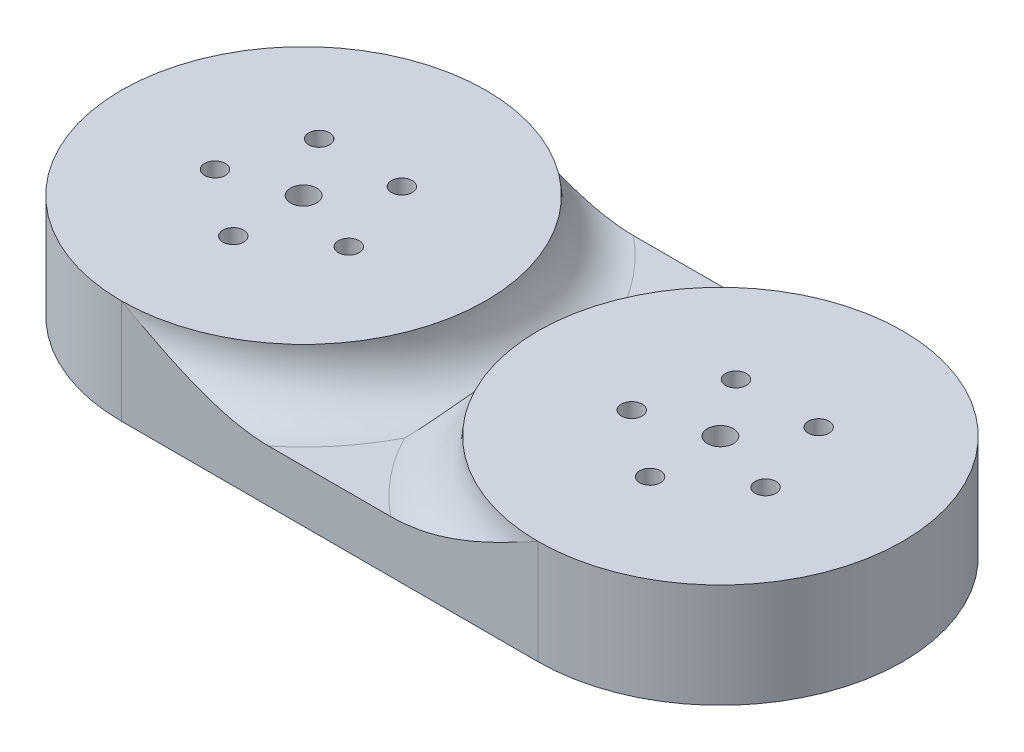
ISO-10303-21;
HEADER;
FILE_DESCRIPTION(('STEP AP214'),'2;1');
FILE_NAME('part.step','',(''),(''),'','','');
FILE_SCHEMA(('AUTOMOTIVE_DESIGN { 1 0 10303 214 1 1 1 1 }'));
ENDSEC;
DATA;
#1=APPLICATION_CONTEXT('core data for automotive mechanical design processes');
#2=APPLICATION_PROTOCOL_DEFINITION('international standard','automotive_design',2000,#1);
#3=PRODUCT_CONTEXT('',#1,'mechanical');
#4=PRODUCT('Part','Part','',(#3));
#5=PRODUCT_RELATED_PRODUCT_CATEGORY('part','',(#4));
#6=PRODUCT_DEFINITION_FORMATION('','',#4);
#7=PRODUCT_DEFINITION_CONTEXT('part definition',#1,'design');
#8=PRODUCT_DEFINITION('design','',#6,#7);
#9=PRODUCT_DEFINITION_SHAPE('','',#8);
#10=(LENGTH_UNIT() NAMED_UNIT(*) SI_UNIT(.MILLI.,.METRE.));
#11=(NAMED_UNIT(*) PLANE_ANGLE_UNIT() SI_UNIT($,.RADIAN.));
#12=(NAMED_UNIT(*) SI_UNIT($,.STERADIAN.) SOLID_ANGLE_UNIT());
#13=UNCERTAINTY_MEASURE_WITH_UNIT(LENGTH_MEASURE(1.E-05),#10,'distance_accuracy_value','');
#14=(GEOMETRIC_REPRESENTATION_CONTEXT(3) GLOBAL_UNCERTAINTY_ASSIGNED_CONTEXT((#13)) GLOBAL_UNIT_ASSIGNED_CONTEXT((#10,
#11,#12)) REPRESENTATION_CONTEXT('',''));
#15=CARTESIAN_POINT('',(0.,0.,0.));
#16=DIRECTION('',(0.,0.,1.));
#17=DIRECTION('',(1.,0.,0.));
#18=AXIS2_PLACEMENT_3D('',#15,#16,#17);
#19=CARTESIAN_POINT('',(80.,0.,0.));
#20=DIRECTION('',(0.,-1.,0.));
#21=DIRECTION('',(0.,0.,-1.));
#22=AXIS2_PLACEMENT_3D('',#19,#20,#21);
#23=PLANE('',#22);
#24=CARTESIAN_POINT('',(80.,0.,0.));
#25=DIRECTION('',(0.,-1.,0.));
#26=DIRECTION('',(0.,0.,-1.));
#27=AXIS2_PLACEMENT_3D('',#24,#25,#26);
#28=CIRCLE('',#27,45.);
#29=CARTESIAN_POINT('',(51.7157287525381,0.,35.));
#30=VERTEX_POINT('',#29);
#31=CARTESIAN_POINT('',(40.,0.,20.6155281280884));
#32=VERTEX_POINT('',#31);
#33=EDGE_CURVE('E143',#30,#32,#28,.T.);
#34=ORIENTED_EDGE('',*,*,#33,.T.);
#35=CARTESIAN_POINT('',(0.,0.,0.));
#36=DIRECTION('',(0.,-1.,0.));
#37=DIRECTION('',(0.,0.,-1.));
#38=AXIS2_PLACEMENT_3D('',#35,#36,#37);
#39=CIRCLE('',#38,45.);
#40=CARTESIAN_POINT('',(28.2842712474619,0.,35.));
#41=VERTEX_POINT('',#40);
#42=EDGE_CURVE('E145',#32,#41,#39,.T.);
#43=ORIENTED_EDGE('',*,*,#42,.T.);
#44=DIRECTION('',(-1.,0.,0.));
#45=VECTOR('',#44,1.);
#46=CARTESIAN_POINT('',(80.,0.,35.));
#47=LINE('',#46,#45);
#48=EDGE_CURVE('E239',#30,#41,#47,.T.);
#49=ORIENTED_EDGE('',*,*,#48,.F.);
#50=EDGE_LOOP('',(#34,#43,#49));
#51=FACE_BOUND('',#50,.T.);
#52=ADVANCED_FACE('F34',(#51),#23,.F.);
#53=DIRECTION('',(1.,0.,0.));
#54=VECTOR('',#53,1.);
#55=CARTESIAN_POINT('',(80.,0.,-35.));
#56=LINE('',#55,#54);
#57=CARTESIAN_POINT('',(28.2842712474619,0.,-35.));
#58=VERTEX_POINT('',#57);
#59=CARTESIAN_POINT('',(51.7157287525381,0.,-35.));
#60=VERTEX_POINT('',#59);
#61=EDGE_CURVE('E109',#58,#60,#56,.T.);
#62=ORIENTED_EDGE('',*,*,#61,.F.);
#63=CARTESIAN_POINT('',(0.,0.,0.));
#64=DIRECTION('',(0.,-1.,0.));
#65=DIRECTION('',(0.,0.,-1.));
#66=AXIS2_PLACEMENT_3D('',#63,#64,#65);
#67=CIRCLE('',#66,45.);
#68=CARTESIAN_POINT('',(40.,0.,-20.6155281280884));
#69=VERTEX_POINT('',#68);
#70=EDGE_CURVE('E141',#58,#69,#67,.T.);
#71=ORIENTED_EDGE('',*,*,#70,.T.);
#72=CARTESIAN_POINT('',(80.,0.,0.));
#73=DIRECTION('',(0.,-1.,0.));
#74=DIRECTION('',(0.,0.,-1.));
#75=AXIS2_PLACEMENT_3D('',#72,#73,#74);
#76=CIRCLE('',#75,45.);
#77=EDGE_CURVE('E139',#69,#60,#76,.T.);
#78=ORIENTED_EDGE('',*,*,#77,.T.);
#79=EDGE_LOOP('',(#62,#71,#78));
#80=FACE_BOUND('',#79,.T.);
#81=ADVANCED_FACE('F167',(#80),#23,.F.);
#82=CARTESIAN_POINT('',(0.,10.,0.));
#83=DIRECTION('',(0.,-1.,0.));
#84=DIRECTION('',(0.,0.,-1.));
#85=AXIS2_PLACEMENT_3D('',#82,#83,#84);
#86=CYLINDRICAL_SURFACE('',#85,35.);
#87=CARTESIAN_POINT('',(0.,10.,0.));
#88=DIRECTION('',(0.,1.,0.));
#89=DIRECTION('',(0.,0.,1.));
#90=AXIS2_PLACEMENT_3D('',#87,#88,#89);
#91=CIRCLE('',#90,35.);
#92=CARTESIAN_POINT('',(0.,10.,-35.));
#93=VERTEX_POINT('',#92);
#94=CARTESIAN_POINT('',(0.,10.,35.));
#95=VERTEX_POINT('',#94);
#96=EDGE_CURVE('E127',#93,#95,#91,.T.);
#97=ORIENTED_EDGE('',*,*,#96,.F.);
#98=DIRECTION('',(0.,1.,0.));
#99=VECTOR('',#98,1.);
#100=CARTESIAN_POINT('',(0.,-10.,-35.));
#101=LINE('',#100,#99);
#102=CARTESIAN_POINT('',(0.,-10.,-35.));
#103=VERTEX_POINT('',#102);
#104=EDGE_CURVE('E120',#103,#93,#101,.T.);
#105=ORIENTED_EDGE('',*,*,#104,.F.);
#106=CARTESIAN_POINT('',(0.,-10.,0.));
#107=DIRECTION('',(0.,-1.,0.));
#108=DIRECTION('',(0.,0.,-1.));
#109=AXIS2_PLACEMENT_3D('',#106,#107,#108);
#110=CIRCLE('',#109,35.);
#111=CARTESIAN_POINT('',(0.,-10.,35.));
#112=VERTEX_POINT('',#111);
#113=EDGE_CURVE('E102',#112,#103,#110,.T.);
#114=ORIENTED_EDGE('',*,*,#113,.F.);
#115=DIRECTION('',(0.,1.,0.));
#116=VECTOR('',#115,1.);
#117=CARTESIAN_POINT('',(0.,-10.,35.));
#118=LINE('',#117,#116);
#119=EDGE_CURVE('E99',#112,#95,#118,.T.);
#120=ORIENTED_EDGE('',*,*,#119,.T.);
#121=EDGE_LOOP('',(#97,#105,#114,#120));
#122=FACE_BOUND('',#121,.T.);
#123=ADVANCED_FACE('F195',(#122),#86,.T.);
#124=CARTESIAN_POINT('',(0.,10.,0.));
#125=DIRECTION('',(0.,1.,0.));
#126=DIRECTION('',(0.,0.,1.));
#127=AXIS2_PLACEMENT_3D('',#124,#125,#126);
#128=PLANE('',#127);
#129=CARTESIAN_POINT('',(0.,10.,0.));
#130=DIRECTION('',(0.,1.,0.));
#131=DIRECTION('',(0.,0.,1.));
#132=AXIS2_PLACEMENT_3D('',#129,#130,#131);
#133=CIRCLE('',#132,2.5);
#134=CARTESIAN_POINT('',(0.,10.,2.5));
#135=VERTEX_POINT('',#134);
#136=EDGE_CURVE('E246',#135,#135,#133,.T.);
#137=ORIENTED_EDGE('',*,*,#136,.F.);
#138=EDGE_LOOP('',(#137));
#139=FACE_BOUND('',#138,.T.);
#140=CARTESIAN_POINT('',(0.,10.,13.5));
#141=DIRECTION('',(0.,-1.,0.));
#142=DIRECTION('',(0.,0.,-1.));
#143=AXIS2_PLACEMENT_3D('',#140,#141,#142);
#144=CIRCLE('',#143,2.);
#145=CARTESIAN_POINT('',(0.,10.,11.5));
#146=VERTEX_POINT('',#145);
#147=EDGE_CURVE('E124',#146,#146,#144,.T.);
#148=ORIENTED_EDGE('',*,*,#147,.T.);
#149=EDGE_LOOP('',(#148));
#150=FACE_BOUND('',#149,.T.);
#151=CARTESIAN_POINT('',(12.8392629699846,10.,4.17172942406179));
#152=DIRECTION('',(0.,-1.,0.));
#153=DIRECTION('',(0.,0.,-1.));
#154=AXIS2_PLACEMENT_3D('',#151,#152,#153);
#155=CIRCLE('',#154,2.00000000000004);
#156=CARTESIAN_POINT('',(12.8392629699846,10.,2.17172942406175));
#157=VERTEX_POINT('',#156);
#158=EDGE_CURVE('E128',#157,#157,#155,.T.);
#159=ORIENTED_EDGE('',*,*,#158,.T.);
#160=EDGE_LOOP('',(#159));
#161=FACE_BOUND('',#160,.T.);
#162=CARTESIAN_POINT('',(7.93510090594839,10.,-10.9217294240618));
#163=DIRECTION('',(0.,-1.,0.));
#164=DIRECTION('',(0.,0.,-1.));
#165=AXIS2_PLACEMENT_3D('',#162,#163,#164);
#166=CIRCLE('',#165,2.00000000000008);
#167=CARTESIAN_POINT('',(7.93510090594839,10.,-12.9217294240619));
#168=VERTEX_POINT('',#167);
#169=EDGE_CURVE('E131',#168,#168,#166,.T.);
#170=ORIENTED_EDGE('',*,*,#169,.T.);
#171=EDGE_LOOP('',(#170));
#172=FACE_BOUND('',#171,.T.);
#173=CARTESIAN_POINT('',(-7.93510090594839,10.,-10.9217294240618));
#174=DIRECTION('',(0.,-1.,0.));
#175=DIRECTION('',(0.,0.,-1.));
#176=AXIS2_PLACEMENT_3D('',#173,#174,#175);
#177=CIRCLE('',#176,2.00000000000011);
#178=CARTESIAN_POINT('',(-7.93510090594839,10.,-12.9217294240619));
#179=VERTEX_POINT('',#178);
#180=EDGE_CURVE('E118',#179,#179,#177,.T.);
#181=ORIENTED_EDGE('',*,*,#180,.T.);
#182=EDGE_LOOP('',(#181));
#183=FACE_BOUND('',#182,.T.);
#184=CARTESIAN_POINT('',(-12.8392629699846,10.,4.17172942406179));
#185=DIRECTION('',(0.,-1.,0.));
#186=DIRECTION('',(0.,0.,-1.));
#187=AXIS2_PLACEMENT_3D('',#184,#185,#186);
#188=CIRCLE('',#187,2.00000000000015);
#189=CARTESIAN_POINT('',(-12.8392629699846,10.,2.17172942406164));
#190=VERTEX_POINT('',#189);
#191=EDGE_CURVE('E115',#190,#190,#188,.T.);
#192=ORIENTED_EDGE('',*,*,#191,.T.);
#193=EDGE_LOOP('',(#192));
#194=FACE_BOUND('',#193,.T.);
#195=EDGE_CURVE('E136',#95,#93,#91,.T.);
#196=ORIENTED_EDGE('',*,*,#195,.T.);
#197=ORIENTED_EDGE('',*,*,#96,.T.);
#198=EDGE_LOOP('',(#196,#197));
#199=FACE_BOUND('',#198,.T.);
#200=ADVANCED_FACE('F198',(#139,#150,#161,#172,#183,#194,#199),#128,.T.);
#201=CARTESIAN_POINT('',(-12.8392629699846,10.,4.17172942406179));
#202=DIRECTION('',(0.,-1.,0.));
#203=DIRECTION('',(0.,0.,-1.));
#204=AXIS2_PLACEMENT_3D('',#201,#202,#203);
#205=CYLINDRICAL_SURFACE('',#204,2.00000000000015);
#206=ORIENTED_EDGE('',*,*,#191,.F.);
#207=EDGE_LOOP('',(#206));
#208=FACE_BOUND('',#207,.T.);
#209=CARTESIAN_POINT('',(-12.8392629699846,-10.,4.17172942406179));
#210=DIRECTION('',(0.,-1.,0.));
#211=DIRECTION('',(0.,0.,-1.));
#212=AXIS2_PLACEMENT_3D('',#209,#210,#211);
#213=CIRCLE('',#212,2.00000000000015);
#214=CARTESIAN_POINT('',(-12.8392629699846,-10.,2.17172942406164));
#215=VERTEX_POINT('',#214);
#216=EDGE_CURVE('E285',#215,#215,#213,.T.);
#217=ORIENTED_EDGE('',*,*,#216,.T.);
#218=EDGE_LOOP('',(#217));
#219=FACE_BOUND('',#218,.T.);
#220=ADVANCED_FACE('F202',(#208,#219),#205,.F.);
#221=CARTESIAN_POINT('',(-7.93510090594839,10.,-10.9217294240618));
#222=DIRECTION('',(0.,-1.,0.));
#223=DIRECTION('',(0.,0.,-1.));
#224=AXIS2_PLACEMENT_3D('',#221,#222,#223);
#225=CYLINDRICAL_SURFACE('',#224,2.00000000000011);
#226=ORIENTED_EDGE('',*,*,#180,.F.);
#227=EDGE_LOOP('',(#226));
#228=FACE_BOUND('',#227,.T.);
#229=CARTESIAN_POINT('',(-7.93510090594839,-10.,-10.9217294240618));
#230=DIRECTION('',(0.,-1.,0.));
#231=DIRECTION('',(0.,0.,-1.));
#232=AXIS2_PLACEMENT_3D('',#229,#230,#231);
#233=CIRCLE('',#232,2.00000000000011);
#234=CARTESIAN_POINT('',(-7.93510090594839,-10.,-12.9217294240619));
#235=VERTEX_POINT('',#234);
#236=EDGE_CURVE('E282',#235,#235,#233,.T.);
#237=ORIENTED_EDGE('',*,*,#236,.T.);
#238=EDGE_LOOP('',(#237));
#239=FACE_BOUND('',#238,.T.);
#240=ADVANCED_FACE('F206',(#228,#239),#225,.F.);
#241=CARTESIAN_POINT('',(7.93510090594839,10.,-10.9217294240618));
#242=DIRECTION('',(0.,-1.,0.));
#243=DIRECTION('',(0.,0.,-1.));
#244=AXIS2_PLACEMENT_3D('',#241,#242,#243);
#245=CYLINDRICAL_SURFACE('',#244,2.00000000000008);
#246=ORIENTED_EDGE('',*,*,#169,.F.);
#247=EDGE_LOOP('',(#246));
#248=FACE_BOUND('',#247,.T.);
#249=CARTESIAN_POINT('',(7.93510090594839,-10.,-10.9217294240618));
#250=DIRECTION('',(0.,-1.,0.));
#251=DIRECTION('',(0.,0.,-1.));
#252=AXIS2_PLACEMENT_3D('',#249,#250,#251);
#253=CIRCLE('',#252,2.00000000000007);
#254=CARTESIAN_POINT('',(7.93510090594839,-10.,-12.9217294240619));
#255=VERTEX_POINT('',#254);
#256=EDGE_CURVE('E279',#255,#255,#253,.T.);
#257=ORIENTED_EDGE('',*,*,#256,.T.);
#258=EDGE_LOOP('',(#257));
#259=FACE_BOUND('',#258,.T.);
#260=ADVANCED_FACE('F210',(#248,#259),#245,.F.);
#261=CARTESIAN_POINT('',(12.8392629699846,10.,4.17172942406179));
#262=DIRECTION('',(0.,-1.,0.));
#263=DIRECTION('',(0.,0.,-1.));
#264=AXIS2_PLACEMENT_3D('',#261,#262,#263);
#265=CYLINDRICAL_SURFACE('',#264,2.00000000000004);
#266=ORIENTED_EDGE('',*,*,#158,.F.);
#267=EDGE_LOOP('',(#266));
#268=FACE_BOUND('',#267,.T.);
#269=CARTESIAN_POINT('',(12.8392629699846,-10.,4.17172942406179));
#270=DIRECTION('',(0.,-1.,0.));
#271=DIRECTION('',(0.,0.,-1.));
#272=AXIS2_PLACEMENT_3D('',#269,#270,#271);
#273=CIRCLE('',#272,2.00000000000004);
#274=CARTESIAN_POINT('',(12.8392629699846,-10.,2.17172942406175));
#275=VERTEX_POINT('',#274);
#276=EDGE_CURVE('E276',#275,#275,#273,.T.);
#277=ORIENTED_EDGE('',*,*,#276,.T.);
#278=EDGE_LOOP('',(#277));
#279=FACE_BOUND('',#278,.T.);
#280=ADVANCED_FACE('F214',(#268,#279),#265,.F.);
#281=CARTESIAN_POINT('',(0.,10.,13.5));
#282=DIRECTION('',(0.,-1.,0.));
#283=DIRECTION('',(0.,0.,-1.));
#284=AXIS2_PLACEMENT_3D('',#281,#282,#283);
#285=CYLINDRICAL_SURFACE('',#284,2.);
#286=ORIENTED_EDGE('',*,*,#147,.F.);
#287=EDGE_LOOP('',(#286));
#288=FACE_BOUND('',#287,.T.);
#289=CARTESIAN_POINT('',(0.,-10.,13.5));
#290=DIRECTION('',(0.,-1.,0.));
#291=DIRECTION('',(0.,0.,-1.));
#292=AXIS2_PLACEMENT_3D('',#289,#290,#291);
#293=CIRCLE('',#292,2.);
#294=CARTESIAN_POINT('',(0.,-10.,11.5));
#295=VERTEX_POINT('',#294);
#296=EDGE_CURVE('E273',#295,#295,#293,.T.);
#297=ORIENTED_EDGE('',*,*,#296,.T.);
#298=EDGE_LOOP('',(#297));
#299=FACE_BOUND('',#298,.T.);
#300=ADVANCED_FACE('F218',(#288,#299),#285,.F.);
#301=CARTESIAN_POINT('',(80.,-10.,0.));
#302=DIRECTION('',(0.,-1.,0.));
#303=DIRECTION('',(0.,0.,-1.));
#304=AXIS2_PLACEMENT_3D('',#301,#302,#303);
#305=PLANE('',#304);
#306=CARTESIAN_POINT('',(0.,-10.,0.));
#307=DIRECTION('',(0.,-1.,0.));
#308=DIRECTION('',(0.,0.,-1.));
#309=AXIS2_PLACEMENT_3D('',#306,#307,#308);
#310=CIRCLE('',#309,2.5);
#311=CARTESIAN_POINT('',(0.,-10.,-2.5));
#312=VERTEX_POINT('',#311);
#313=EDGE_CURVE('E468',#312,#312,#310,.T.);
#314=ORIENTED_EDGE('',*,*,#313,.F.);
#315=EDGE_LOOP('',(#314));
#316=FACE_BOUND('',#315,.T.);
#317=CARTESIAN_POINT('',(80.,-10.,0.));
#318=DIRECTION('',(0.,-1.,0.));
#319=DIRECTION('',(0.,0.,-1.));
#320=AXIS2_PLACEMENT_3D('',#317,#318,#319);
#321=CIRCLE('',#320,2.50000000000001);
#322=CARTESIAN_POINT('',(80.,-10.,-2.50000000000001));
#323=VERTEX_POINT('',#322);
#324=EDGE_CURVE('E469',#323,#323,#321,.T.);
#325=ORIENTED_EDGE('',*,*,#324,.F.);
#326=EDGE_LOOP('',(#325));
#327=FACE_BOUND('',#326,.T.);
#328=CARTESIAN_POINT('',(92.8392629699846,-10.,4.17172942406179));
#329=DIRECTION('',(0.,-1.,0.));
#330=DIRECTION('',(0.,0.,1.));
#331=AXIS2_PLACEMENT_3D('',#328,#329,#330);
#332=CIRCLE('',#331,2.00000000000017);
#333=CARTESIAN_POINT('',(92.8392629699846,-10.,6.17172942406196));
#334=VERTEX_POINT('',#333);
#335=EDGE_CURVE('E264',#334,#334,#332,.T.);
#336=ORIENTED_EDGE('',*,*,#335,.F.);
#337=EDGE_LOOP('',(#336));
#338=FACE_BOUND('',#337,.T.);
#339=CARTESIAN_POINT('',(72.0648990940516,-10.,-10.9217294240618));
#340=DIRECTION('',(0.,-1.,0.));
#341=DIRECTION('',(0.,0.,1.));
#342=AXIS2_PLACEMENT_3D('',#339,#340,#341);
#343=CIRCLE('',#342,2.00000000000008);
#344=CARTESIAN_POINT('',(72.0648990940516,-10.,-8.92172942406171));
#345=VERTEX_POINT('',#344);
#346=EDGE_CURVE('E270',#345,#345,#343,.T.);
#347=ORIENTED_EDGE('',*,*,#346,.F.);
#348=EDGE_LOOP('',(#347));
#349=FACE_BOUND('',#348,.T.);
#350=ORIENTED_EDGE('',*,*,#276,.F.);
#351=EDGE_LOOP('',(#350));
#352=FACE_BOUND('',#351,.T.);
#353=ORIENTED_EDGE('',*,*,#236,.F.);
#354=EDGE_LOOP('',(#353));
#355=FACE_BOUND('',#354,.T.);
#356=CARTESIAN_POINT('',(67.1607370300154,-10.,4.17172942406179));
#357=DIRECTION('',(0.,-1.,0.));
#358=DIRECTION('',(0.,0.,1.));
#359=AXIS2_PLACEMENT_3D('',#356,#357,#358);
#360=CIRCLE('',#359,2.00000000000004);
#361=CARTESIAN_POINT('',(67.1607370300154,-10.,6.17172942406183));
#362=VERTEX_POINT('',#361);
#363=EDGE_CURVE('E288',#362,#362,#360,.T.);
#364=ORIENTED_EDGE('',*,*,#363,.F.);
#365=EDGE_LOOP('',(#364));
#366=FACE_BOUND('',#365,.T.);
#367=CARTESIAN_POINT('',(80.,-10.,0.));
#368=DIRECTION('',(0.,-1.,0.));
#369=DIRECTION('',(0.,0.,-1.));
#370=AXIS2_PLACEMENT_3D('',#367,#368,#369);
#371=CIRCLE('',#370,35.);
#372=CARTESIAN_POINT('',(80.,-10.,-35.));
#373=VERTEX_POINT('',#372);
#374=CARTESIAN_POINT('',(80.,-10.,35.));
#375=VERTEX_POINT('',#374);
#376=EDGE_CURVE('E103',#373,#375,#371,.T.);
#377=ORIENTED_EDGE('',*,*,#376,.T.);
#378=DIRECTION('',(-1.,0.,0.));
#379=VECTOR('',#378,1.);
#380=CARTESIAN_POINT('',(80.,-10.,35.));
#381=LINE('',#380,#379);
#382=EDGE_CURVE('E95',#375,#112,#381,.T.);
#383=ORIENTED_EDGE('',*,*,#382,.T.);
#384=ORIENTED_EDGE('',*,*,#113,.T.);
#385=DIRECTION('',(1.,0.,0.));
#386=VECTOR('',#385,1.);
#387=CARTESIAN_POINT('',(80.,-10.,-35.));
#388=LINE('',#387,#386);
#389=EDGE_CURVE('E108',#103,#373,#388,.T.);
#390=ORIENTED_EDGE('',*,*,#389,.T.);
#391=EDGE_LOOP('',(#377,#383,#384,#390));
#392=FACE_BOUND('',#391,.T.);
#393=ORIENTED_EDGE('',*,*,#216,.F.);
#394=EDGE_LOOP('',(#393));
#395=FACE_BOUND('',#394,.T.);
#396=ORIENTED_EDGE('',*,*,#256,.F.);
#397=EDGE_LOOP('',(#396));
#398=FACE_BOUND('',#397,.T.);
#399=ORIENTED_EDGE('',*,*,#296,.F.);
#400=EDGE_LOOP('',(#399));
#401=FACE_BOUND('',#400,.T.);
#402=CARTESIAN_POINT('',(87.9351009059484,-10.,-10.9217294240618));
#403=DIRECTION('',(0.,-1.,0.));
#404=DIRECTION('',(0.,0.,1.));
#405=AXIS2_PLACEMENT_3D('',#402,#403,#404);
#406=CIRCLE('',#405,2.00000000000011);
#407=CARTESIAN_POINT('',(87.9351009059484,-10.,-8.92172942406168));
#408=VERTEX_POINT('',#407);
#409=EDGE_CURVE('E267',#408,#408,#406,.T.);
#410=ORIENTED_EDGE('',*,*,#409,.F.);
#411=EDGE_LOOP('',(#410));
#412=FACE_BOUND('',#411,.T.);
#413=CARTESIAN_POINT('',(80.,-10.,13.5));
#414=DIRECTION('',(0.,-1.,0.));
#415=DIRECTION('',(0.,0.,1.));
#416=AXIS2_PLACEMENT_3D('',#413,#414,#415);
#417=CIRCLE('',#416,2.00000000000001);
#418=CARTESIAN_POINT('',(80.,-10.,15.5));
#419=VERTEX_POINT('',#418);
#420=EDGE_CURVE('E256',#419,#419,#417,.T.);
#421=ORIENTED_EDGE('',*,*,#420,.F.);
#422=EDGE_LOOP('',(#421));
#423=FACE_BOUND('',#422,.T.);
#424=ADVANCED_FACE('F105',(#316,#327,#338,#349,#352,#355,#366,#392,#395,#398,#401,#412,#423),
#305,.T.);
#425=CARTESIAN_POINT('',(80.,-10.,0.));
#426=DIRECTION('',(0.,1.,0.));
#427=DIRECTION('',(0.,0.,1.));
#428=AXIS2_PLACEMENT_3D('',#425,#426,#427);
#429=CYLINDRICAL_SURFACE('',#428,35.);
#430=CARTESIAN_POINT('',(80.,10.,0.));
#431=DIRECTION('',(0.,1.,0.));
#432=DIRECTION('',(0.,0.,1.));
#433=AXIS2_PLACEMENT_3D('',#430,#431,#432);
#434=CIRCLE('',#433,35.);
#435=CARTESIAN_POINT('',(80.,10.,35.));
#436=VERTEX_POINT('',#435);
#437=CARTESIAN_POINT('',(80.,10.,-35.));
#438=VERTEX_POINT('',#437);
#439=EDGE_CURVE('E113',#436,#438,#434,.T.);
#440=ORIENTED_EDGE('',*,*,#439,.F.);
#441=DIRECTION('',(0.,1.,0.));
#442=VECTOR('',#441,1.);
#443=CARTESIAN_POINT('',(80.,-10.,35.));
#444=LINE('',#443,#442);
#445=EDGE_CURVE('E59',#375,#436,#444,.T.);
#446=ORIENTED_EDGE('',*,*,#445,.F.);
#447=ORIENTED_EDGE('',*,*,#376,.F.);
#448=DIRECTION('',(0.,1.,0.));
#449=VECTOR('',#448,1.);
#450=CARTESIAN_POINT('',(80.,-10.,-35.));
#451=LINE('',#450,#449);
#452=EDGE_CURVE('E52',#373,#438,#451,.T.);
#453=ORIENTED_EDGE('',*,*,#452,.T.);
#454=EDGE_LOOP('',(#440,#446,#447,#453));
#455=FACE_BOUND('',#454,.T.);
#456=ADVANCED_FACE('F111',(#455),#429,.T.);
#457=CARTESIAN_POINT('',(80.,-10.,35.));
#458=DIRECTION('',(0.,0.,-1.));
#459=DIRECTION('',(-1.,0.,0.));
#460=AXIS2_PLACEMENT_3D('',#457,#458,#459);
#461=PLANE('',#460);
#462=ORIENTED_EDGE('',*,*,#445,.T.);
#463=CARTESIAN_POINT('',(51.7157287525381,0.,35.));
#464=CARTESIAN_POINT('',(52.1332996255244,1.95080952797442E-05,35.));
#465=CARTESIAN_POINT('',(52.5507923160403,0.0103315241049758,35.));
#466=CARTESIAN_POINT('',(53.3847256130278,0.050012423185838,35.));
#467=CARTESIAN_POINT('',(53.8011665550668,0.079374165037005,35.));
#468=CARTESIAN_POINT('',(54.631536599904,0.155548116187747,35.));
#469=CARTESIAN_POINT('',(55.0454691505825,0.202323329114866,35.));
#470=CARTESIAN_POINT('',(55.871214242878,0.311958318905803,35.));
#471=CARTESIAN_POINT('',(56.2830265616008,0.374819753018777,35.));
#472=CARTESIAN_POINT('',(57.5038673157086,0.583737736210737,35.));
#473=CARTESIAN_POINT('',(58.3092849753346,0.751208365271264,35.));
#474=CARTESIAN_POINT('',(59.9086792466437,1.13489290698003,35.));
#475=CARTESIAN_POINT('',(60.7026486127555,1.35113636112055,35.));
#476=CARTESIAN_POINT('',(62.2989685598841,1.83081487686646,35.));
#477=CARTESIAN_POINT('',(63.1009878293673,2.09534424143795,35.));
#478=CARTESIAN_POINT('',(64.6923856740858,2.66023625073049,35.));
#479=CARTESIAN_POINT('',(65.4817614375084,2.96060674409471,35.));
#480=CARTESIAN_POINT('',(67.0490719711575,3.59080382279427,35.));
#481=CARTESIAN_POINT('',(67.8270004541012,3.92064593980515,35.));
#482=CARTESIAN_POINT('',(69.3724857995635,4.60388092472075,35.));
#483=CARTESIAN_POINT('',(70.1400415009284,4.95727640340485,35.));
#484=CARTESIAN_POINT('',(72.4377602232626,6.04859569324885,35.));
#485=CARTESIAN_POINT('',(73.9546978390963,6.81419573143975,35.));
#486=CARTESIAN_POINT('',(76.9701095083109,8.38060630128789,35.));
#487=CARTESIAN_POINT('',(78.4685803443314,9.18142286051897,35.));
#488=CARTESIAN_POINT('',(79.9780011213578,9.98824110556865,35.));
#489=CARTESIAN_POINT('',(79.9890005601703,9.99412055293635,35.));
#490=CARTESIAN_POINT('',(80.,10.,35.));
#491=B_SPLINE_CURVE_WITH_KNOTS('',3,(#463,#464,#465,#466,#467,#468,#469,#470,#471,#472,#473,
#474,#475,#476,#477,#478,#479,#480,#481,#482,#483,#484,#485,#486,#487,#488,#489,#490),
.UNSPECIFIED.,.F.,.F.,(4,2,2,2,2,2,2,2,2,2,2,2,2,4),(0.,1.25247189904129,2.50447455177727,
3.7538322613836,5.00331873529908,7.46925812597134,9.9366951558855,12.4692144265099,
15.0022893003083,17.5367070794229,20.0714062555581,25.1676796093006,30.2648286497893,
30.302245223656),.UNSPECIFIED.);
#492=EDGE_CURVE('E44',#436,#30,#491,.F.);
#493=ORIENTED_EDGE('',*,*,#492,.T.);
#494=ORIENTED_EDGE('',*,*,#48,.T.);
#495=CARTESIAN_POINT('',(28.2842712474619,0.,35.));
#496=CARTESIAN_POINT('',(27.8667003744747,1.95080952802758E-05,35.));
#497=CARTESIAN_POINT('',(27.449207683958,0.0103315241050164,35.));
#498=CARTESIAN_POINT('',(26.6152743869689,0.0500124231860324,35.));
#499=CARTESIAN_POINT('',(26.1988334449291,0.0793741650373129,35.));
#500=CARTESIAN_POINT('',(25.3684634000903,0.155548116188332,35.));
#501=CARTESIAN_POINT('',(24.9545308494112,0.202323329115608,35.));
#502=CARTESIAN_POINT('',(24.1287857571144,0.311958318906898,35.));
#503=CARTESIAN_POINT('',(23.7169734383911,0.374819753020068,35.));
#504=CARTESIAN_POINT('',(22.4961326842842,0.583737736212181,35.));
#505=CARTESIAN_POINT('',(21.6907150246598,0.751208365272515,35.));
#506=CARTESIAN_POINT('',(20.0913207533537,1.13489290698076,35.));
#507=CARTESIAN_POINT('',(19.2973513872431,1.35113636112095,35.));
#508=CARTESIAN_POINT('',(17.7010314401162,1.83081487686637,35.));
#509=CARTESIAN_POINT('',(16.8990121706333,2.09534424143774,35.));
#510=CARTESIAN_POINT('',(15.3076143259153,2.66023625073012,35.));
#511=CARTESIAN_POINT('',(14.5182385624929,2.9606067440943,35.));
#512=CARTESIAN_POINT('',(12.9509280288445,3.59080382279336,35.));
#513=CARTESIAN_POINT('',(12.1729995459013,3.92064593980374,35.));
#514=CARTESIAN_POINT('',(10.6275142004405,4.60388092471928,35.));
#515=CARTESIAN_POINT('',(9.85995849907652,4.95727640340382,35.));
#516=CARTESIAN_POINT('',(7.5622397767407,6.04859569324463,35.));
#517=CARTESIAN_POINT('',(6.04530216090161,6.81419573142665,35.));
#518=CARTESIAN_POINT('',(3.02989049169762,8.38060630129762,35.));
#519=CARTESIAN_POINT('',(1.53141965569307,9.18142286056042,35.));
#520=CARTESIAN_POINT('',(0.0219988786432528,9.9882411055689,35.));
#521=CARTESIAN_POINT('',(0.0109994398302576,9.99412055293648,35.));
#522=CARTESIAN_POINT('',(0.,10.,35.));
#523=B_SPLINE_CURVE_WITH_KNOTS('',3,(#495,#496,#497,#498,#499,#500,#501,#502,#503,#504,#505,
#506,#507,#508,#509,#510,#511,#512,#513,#514,#515,#516,#517,#518,#519,#520,#521,#522),
.UNSPECIFIED.,.F.,.F.,(4,2,2,2,2,2,2,2,2,2,2,2,2,4),(0.,1.2524718990438,2.50447455178229,
3.75383226139058,5.00331873530801,7.46925812597547,9.93669515588551,12.469214426509,
15.0022893003068,17.5367070794193,20.0714062555527,25.1676796092968,30.2648286497881,
30.302245223656),.UNSPECIFIED.);
#524=EDGE_CURVE('E154',#41,#95,#523,.T.);
#525=ORIENTED_EDGE('',*,*,#524,.T.);
#526=ORIENTED_EDGE('',*,*,#119,.F.);
#527=ORIENTED_EDGE('',*,*,#382,.F.);
#528=EDGE_LOOP('',(#462,#493,#494,#525,#526,#527));
#529=FACE_BOUND('',#528,.T.);
#530=ADVANCED_FACE('F97',(#529),#461,.F.);
#531=CARTESIAN_POINT('',(80.,-10.,-35.));
#532=DIRECTION('',(0.,0.,1.));
#533=DIRECTION('',(1.,0.,0.));
#534=AXIS2_PLACEMENT_3D('',#531,#532,#533);
#535=PLANE('',#534);
#536=ORIENTED_EDGE('',*,*,#104,.T.);
#537=CARTESIAN_POINT('',(28.2842712474619,0.,-35.));
#538=CARTESIAN_POINT('',(27.8667003744747,1.95080952802758E-05,-35.));
#539=CARTESIAN_POINT('',(27.449207683958,0.0103315241050164,-35.));
#540=CARTESIAN_POINT('',(26.6152743869689,0.0500124231860324,-35.));
#541=CARTESIAN_POINT('',(26.1988334449291,0.0793741650373129,-35.));
#542=CARTESIAN_POINT('',(25.3684634000903,0.155548116188332,-35.));
#543=CARTESIAN_POINT('',(24.9545308494112,0.202323329115608,-35.));
#544=CARTESIAN_POINT('',(24.1287857571144,0.311958318906898,-35.));
#545=CARTESIAN_POINT('',(23.7169734383911,0.374819753020068,-35.));
#546=CARTESIAN_POINT('',(22.4961326842842,0.583737736212181,-35.));
#547=CARTESIAN_POINT('',(21.6907150246598,0.751208365272515,-35.));
#548=CARTESIAN_POINT('',(20.0913207533537,1.13489290698076,-35.));
#549=CARTESIAN_POINT('',(19.2973513872431,1.35113636112095,-35.));
#550=CARTESIAN_POINT('',(17.7010314401162,1.83081487686637,-35.));
#551=CARTESIAN_POINT('',(16.8990121706333,2.09534424143774,-35.));
#552=CARTESIAN_POINT('',(15.3076143259153,2.66023625073012,-35.));
#553=CARTESIAN_POINT('',(14.5182385624929,2.9606067440943,-35.));
#554=CARTESIAN_POINT('',(12.9509280288445,3.59080382279336,-35.));
#555=CARTESIAN_POINT('',(12.1729995459013,3.92064593980374,-35.));
#556=CARTESIAN_POINT('',(10.6275142004405,4.60388092471928,-35.));
#557=CARTESIAN_POINT('',(9.85995849907652,4.95727640340382,-35.));
#558=CARTESIAN_POINT('',(7.5622397767407,6.04859569324463,-35.));
#559=CARTESIAN_POINT('',(6.04530216090161,6.81419573142665,-35.));
#560=CARTESIAN_POINT('',(3.02989049169762,8.38060630129762,-35.));
#561=CARTESIAN_POINT('',(1.53141965569307,9.18142286056042,-35.));
#562=CARTESIAN_POINT('',(0.0219988786432528,9.9882411055689,-35.));
#563=CARTESIAN_POINT('',(0.0109994398302576,9.99412055293648,-35.));
#564=CARTESIAN_POINT('',(0.,10.,-35.));
#565=B_SPLINE_CURVE_WITH_KNOTS('',3,(#537,#538,#539,#540,#541,#542,#543,#544,#545,#546,#547,
#548,#549,#550,#551,#552,#553,#554,#555,#556,#557,#558,#559,#560,#561,#562,#563,#564),
.UNSPECIFIED.,.F.,.F.,(4,2,2,2,2,2,2,2,2,2,2,2,2,4),(0.,1.2524718990438,2.50447455178229,
3.75383226139058,5.00331873530801,7.46925812597547,9.93669515588551,12.469214426509,
15.0022893003068,17.5367070794193,20.0714062555527,25.1676796092968,30.2648286497881,
30.302245223656),.UNSPECIFIED.);
#566=EDGE_CURVE('E147',#93,#58,#565,.F.);
#567=ORIENTED_EDGE('',*,*,#566,.T.);
#568=ORIENTED_EDGE('',*,*,#61,.T.);
#569=CARTESIAN_POINT('',(51.7157287525381,0.,-35.));
#570=CARTESIAN_POINT('',(52.1332996255244,1.95080952797442E-05,-35.));
#571=CARTESIAN_POINT('',(52.5507923160403,0.0103315241049758,-35.));
#572=CARTESIAN_POINT('',(53.3847256130278,0.050012423185838,-35.));
#573=CARTESIAN_POINT('',(53.8011665550668,0.079374165037005,-35.));
#574=CARTESIAN_POINT('',(54.631536599904,0.155548116187747,-35.));
#575=CARTESIAN_POINT('',(55.0454691505825,0.202323329114866,-35.));
#576=CARTESIAN_POINT('',(55.871214242878,0.311958318905803,-35.));
#577=CARTESIAN_POINT('',(56.2830265616008,0.374819753018777,-35.));
#578=CARTESIAN_POINT('',(57.5038673157086,0.583737736210737,-35.));
#579=CARTESIAN_POINT('',(58.3092849753346,0.751208365271264,-35.));
#580=CARTESIAN_POINT('',(59.9086792466437,1.13489290698003,-35.));
#581=CARTESIAN_POINT('',(60.7026486127555,1.35113636112055,-35.));
#582=CARTESIAN_POINT('',(62.2989685598841,1.83081487686646,-35.));
#583=CARTESIAN_POINT('',(63.1009878293673,2.09534424143795,-35.));
#584=CARTESIAN_POINT('',(64.6923856740858,2.66023625073049,-35.));
#585=CARTESIAN_POINT('',(65.4817614375084,2.96060674409471,-35.));
#586=CARTESIAN_POINT('',(67.0490719711575,3.59080382279427,-35.));
#587=CARTESIAN_POINT('',(67.8270004541012,3.92064593980515,-35.));
#588=CARTESIAN_POINT('',(69.3724857995635,4.60388092472075,-35.));
#589=CARTESIAN_POINT('',(70.1400415009284,4.95727640340485,-35.));
#590=CARTESIAN_POINT('',(72.4377602232626,6.04859569324885,-35.));
#591=CARTESIAN_POINT('',(73.9546978390963,6.81419573143975,-35.));
#592=CARTESIAN_POINT('',(76.9701095083109,8.38060630128789,-35.));
#593=CARTESIAN_POINT('',(78.4685803443314,9.18142286051897,-35.));
#594=CARTESIAN_POINT('',(79.9780011213578,9.98824110556865,-35.));
#595=CARTESIAN_POINT('',(79.9890005601703,9.99412055293635,-35.));
#596=CARTESIAN_POINT('',(80.,10.,-35.));
#597=B_SPLINE_CURVE_WITH_KNOTS('',3,(#569,#570,#571,#572,#573,#574,#575,#576,#577,#578,#579,
#580,#581,#582,#583,#584,#585,#586,#587,#588,#589,#590,#591,#592,#593,#594,#595,#596),
.UNSPECIFIED.,.F.,.F.,(4,2,2,2,2,2,2,2,2,2,2,2,2,4),(0.,1.25247189904129,2.50447455177727,
3.7538322613836,5.00331873529908,7.46925812597134,9.9366951558855,12.4692144265099,
15.0022893003083,17.5367070794229,20.0714062555581,25.1676796093006,30.2648286497893,
30.302245223656),.UNSPECIFIED.);
#598=EDGE_CURVE('E11',#60,#438,#597,.T.);
#599=ORIENTED_EDGE('',*,*,#598,.T.);
#600=ORIENTED_EDGE('',*,*,#452,.F.);
#601=ORIENTED_EDGE('',*,*,#389,.F.);
#602=EDGE_LOOP('',(#536,#567,#568,#599,#600,#601));
#603=FACE_BOUND('',#602,.T.);
#604=ADVANCED_FACE('F161',(#603),#535,.F.);
#605=CARTESIAN_POINT('',(67.1607370300154,-10.,4.17172942406179));
#606=DIRECTION('',(0.,1.,0.));
#607=DIRECTION('',(0.,0.,1.));
#608=AXIS2_PLACEMENT_3D('',#605,#606,#607);
#609=CYLINDRICAL_SURFACE('',#608,2.00000000000004);
#610=ORIENTED_EDGE('',*,*,#363,.T.);
#611=EDGE_LOOP('',(#610));
#612=FACE_BOUND('',#611,.T.);
#613=CARTESIAN_POINT('',(67.1607370300154,10.,4.17172942406179));
#614=DIRECTION('',(0.,1.,0.));
#615=DIRECTION('',(0.,0.,1.));
#616=AXIS2_PLACEMENT_3D('',#613,#614,#615);
#617=CIRCLE('',#616,2.00000000000004);
#618=CARTESIAN_POINT('',(67.1607370300154,10.,6.17172942406183));
#619=VERTEX_POINT('',#618);
#620=EDGE_CURVE('E310',#619,#619,#617,.T.);
#621=ORIENTED_EDGE('',*,*,#620,.T.);
#622=EDGE_LOOP('',(#621));
#623=FACE_BOUND('',#622,.T.);
#624=ADVANCED_FACE('F165',(#612,#623),#609,.F.);
#625=CARTESIAN_POINT('',(72.0648990940516,-10.,-10.9217294240618));
#626=DIRECTION('',(0.,1.,0.));
#627=DIRECTION('',(0.,0.,1.));
#628=AXIS2_PLACEMENT_3D('',#625,#626,#627);
#629=CYLINDRICAL_SURFACE('',#628,2.00000000000008);
#630=ORIENTED_EDGE('',*,*,#346,.T.);
#631=EDGE_LOOP('',(#630));
#632=FACE_BOUND('',#631,.T.);
#633=CARTESIAN_POINT('',(72.0648990940516,10.,-10.9217294240618));
#634=DIRECTION('',(0.,1.,0.));
#635=DIRECTION('',(0.,0.,1.));
#636=AXIS2_PLACEMENT_3D('',#633,#634,#635);
#637=CIRCLE('',#636,2.00000000000008);
#638=CARTESIAN_POINT('',(72.0648990940516,10.,-8.92172942406171));
#639=VERTEX_POINT('',#638);
#640=EDGE_CURVE('E254',#639,#639,#637,.T.);
#641=ORIENTED_EDGE('',*,*,#640,.T.);
#642=EDGE_LOOP('',(#641));
#643=FACE_BOUND('',#642,.T.);
#644=ADVANCED_FACE('F339',(#632,#643),#629,.F.);
#645=CARTESIAN_POINT('',(87.9351009059484,-10.,-10.9217294240618));
#646=DIRECTION('',(0.,1.,0.));
#647=DIRECTION('',(0.,0.,1.));
#648=AXIS2_PLACEMENT_3D('',#645,#646,#647);
#649=CYLINDRICAL_SURFACE('',#648,2.00000000000011);
#650=ORIENTED_EDGE('',*,*,#409,.T.);
#651=EDGE_LOOP('',(#650));
#652=FACE_BOUND('',#651,.T.);
#653=CARTESIAN_POINT('',(87.9351009059484,10.,-10.9217294240618));
#654=DIRECTION('',(0.,1.,0.));
#655=DIRECTION('',(0.,0.,1.));
#656=AXIS2_PLACEMENT_3D('',#653,#654,#655);
#657=CIRCLE('',#656,2.00000000000011);
#658=CARTESIAN_POINT('',(87.9351009059484,10.,-8.92172942406168));
#659=VERTEX_POINT('',#658);
#660=EDGE_CURVE('E245',#659,#659,#657,.T.);
#661=ORIENTED_EDGE('',*,*,#660,.T.);
#662=EDGE_LOOP('',(#661));
#663=FACE_BOUND('',#662,.T.);
#664=ADVANCED_FACE('F332',(#652,#663),#649,.F.);
#665=CARTESIAN_POINT('',(92.8392629699846,-10.,4.17172942406179));
#666=DIRECTION('',(0.,1.,0.));
#667=DIRECTION('',(0.,0.,1.));
#668=AXIS2_PLACEMENT_3D('',#665,#666,#667);
#669=CYLINDRICAL_SURFACE('',#668,2.00000000000017);
#670=ORIENTED_EDGE('',*,*,#335,.T.);
#671=EDGE_LOOP('',(#670));
#672=FACE_BOUND('',#671,.T.);
#673=CARTESIAN_POINT('',(92.8392629699846,10.,4.17172942406179));
#674=DIRECTION('',(0.,1.,0.));
#675=DIRECTION('',(0.,0.,1.));
#676=AXIS2_PLACEMENT_3D('',#673,#674,#675);
#677=CIRCLE('',#676,2.00000000000017);
#678=CARTESIAN_POINT('',(92.8392629699846,10.,6.17172942406196));
#679=VERTEX_POINT('',#678);
#680=EDGE_CURVE('E314',#679,#679,#677,.T.);
#681=ORIENTED_EDGE('',*,*,#680,.T.);
#682=EDGE_LOOP('',(#681));
#683=FACE_BOUND('',#682,.T.);
#684=ADVANCED_FACE('F326',(#672,#683),#669,.F.);
#685=CARTESIAN_POINT('',(80.,-10.,13.5));
#686=DIRECTION('',(0.,1.,0.));
#687=DIRECTION('',(0.,0.,1.));
#688=AXIS2_PLACEMENT_3D('',#685,#686,#687);
#689=CYLINDRICAL_SURFACE('',#688,2.00000000000001);
#690=ORIENTED_EDGE('',*,*,#420,.T.);
#691=EDGE_LOOP('',(#690));
#692=FACE_BOUND('',#691,.T.);
#693=CARTESIAN_POINT('',(80.,10.,13.5));
#694=DIRECTION('',(0.,1.,0.));
#695=DIRECTION('',(0.,0.,1.));
#696=AXIS2_PLACEMENT_3D('',#693,#694,#695);
#697=CIRCLE('',#696,2.00000000000001);
#698=CARTESIAN_POINT('',(80.,10.,15.5));
#699=VERTEX_POINT('',#698);
#700=EDGE_CURVE('E258',#699,#699,#697,.T.);
#701=ORIENTED_EDGE('',*,*,#700,.T.);
#702=EDGE_LOOP('',(#701));
#703=FACE_BOUND('',#702,.T.);
#704=ADVANCED_FACE('F302',(#692,#703),#689,.F.);
#705=CARTESIAN_POINT('',(80.,10.,0.));
#706=DIRECTION('',(0.,1.,0.));
#707=DIRECTION('',(0.,0.,1.));
#708=AXIS2_PLACEMENT_3D('',#705,#706,#707);
#709=PLANE('',#708);
#710=CARTESIAN_POINT('',(80.,10.,0.));
#711=DIRECTION('',(0.,1.,0.));
#712=DIRECTION('',(0.,0.,1.));
#713=AXIS2_PLACEMENT_3D('',#710,#711,#712);
#714=CIRCLE('',#713,2.50000000000001);
#715=CARTESIAN_POINT('',(80.,10.,2.50000000000001));
#716=VERTEX_POINT('',#715);
#717=EDGE_CURVE('E39',#716,#716,#714,.T.);
#718=ORIENTED_EDGE('',*,*,#717,.F.);
#719=EDGE_LOOP('',(#718));
#720=FACE_BOUND('',#719,.T.);
#721=ORIENTED_EDGE('',*,*,#680,.F.);
#722=EDGE_LOOP('',(#721));
#723=FACE_BOUND('',#722,.T.);
#724=ORIENTED_EDGE('',*,*,#700,.F.);
#725=EDGE_LOOP('',(#724));
#726=FACE_BOUND('',#725,.T.);
#727=ORIENTED_EDGE('',*,*,#439,.T.);
#728=EDGE_CURVE('E252',#438,#436,#434,.T.);
#729=ORIENTED_EDGE('',*,*,#728,.T.);
#730=EDGE_LOOP('',(#727,#729));
#731=FACE_BOUND('',#730,.T.);
#732=ORIENTED_EDGE('',*,*,#640,.F.);
#733=EDGE_LOOP('',(#732));
#734=FACE_BOUND('',#733,.T.);
#735=ORIENTED_EDGE('',*,*,#620,.F.);
#736=EDGE_LOOP('',(#735));
#737=FACE_BOUND('',#736,.T.);
#738=ORIENTED_EDGE('',*,*,#660,.F.);
#739=EDGE_LOOP('',(#738));
#740=FACE_BOUND('',#739,.T.);
#741=ADVANCED_FACE('F189',(#720,#723,#726,#731,#734,#737,#740),#709,.T.);
#742=CARTESIAN_POINT('',(80.,10.,0.));
#743=DIRECTION('',(0.,-1.,0.));
#744=DIRECTION('',(0.,0.,-1.));
#745=AXIS2_PLACEMENT_3D('',#742,#743,#744);
#746=TOROIDAL_SURFACE('',#745,45.,10.);
#747=ORIENTED_EDGE('',*,*,#598,.F.);
#748=ORIENTED_EDGE('',*,*,#77,.F.);
#749=CARTESIAN_POINT('',(40.,0.,-20.6155281280883));
#750=CARTESIAN_POINT('',(40.,3.13592953097516E-09,-20.6081409466423));
#751=CARTESIAN_POINT('',(40.,1.72103571830286E-06,-20.600753760529));
#752=CARTESIAN_POINT('',(40.,0.000392776013733695,-19.7581628977069));
#753=CARTESIAN_POINT('',(40.,0.0226462913205693,-18.9229074531944));
#754=CARTESIAN_POINT('',(40.,0.0987754904306099,-17.2538127216689));
#755=CARTESIAN_POINT('',(40.,0.152661191313013,-16.4199739672096));
#756=CARTESIAN_POINT('',(40.,0.280771164702289,-14.7527023668953));
#757=CARTESIAN_POINT('',(40.,0.355025003969092,-13.9192718892915));
#758=CARTESIAN_POINT('',(40.,0.512810010384332,-12.2532793291446));
#759=CARTESIAN_POINT('',(40.,0.5963418020167,-11.4207173088676));
#760=CARTESIAN_POINT('',(40.,0.761852288148401,-9.75637983226516));
#761=CARTESIAN_POINT('',(40.,0.843832623442513,-8.92460454419399));
#762=CARTESIAN_POINT('',(40.,0.996118901655162,-7.25992361984267));
#763=CARTESIAN_POINT('',(40.,1.06642481022152,-6.42701798024372));
#764=CARTESIAN_POINT('',(40.,1.1563657027375,-5.17737437641596));
#765=CARTESIAN_POINT('',(40.,1.18373987212859,-4.76119855328253));
#766=CARTESIAN_POINT('',(40.,1.23246824067752,-3.92849197110481));
#767=CARTESIAN_POINT('',(40.,1.25382246043646,-3.51196121328005));
#768=CARTESIAN_POINT('',(40.,1.28977266946744,-2.67862523405514));
#769=CARTESIAN_POINT('',(40.,1.30436899101453,-2.26182002715855));
#770=CARTESIAN_POINT('',(40.,1.32629814675587,-1.42801613072729));
#771=CARTESIAN_POINT('',(40.,1.33363097190599,-1.01101744095236));
#772=CARTESIAN_POINT('',(40.,1.3409830142334,-0.152274400624376));
#773=CARTESIAN_POINT('',(40.,1.34054374300752,0.289473992634129));
#774=CARTESIAN_POINT('',(40.,1.3312391118285,1.17288126048696));
#775=CARTESIAN_POINT('',(40.,1.32237373815676,1.61454013493437));
#776=CARTESIAN_POINT('',(40.,1.29656748387218,2.4976405941677));
#777=CARTESIAN_POINT('',(40.,1.27962620620188,2.9390821672015));
#778=CARTESIAN_POINT('',(40.,1.2383287938497,3.82161518279416));
#779=CARTESIAN_POINT('',(40.,1.21397263741415,4.26270662432201));
#780=CARTESIAN_POINT('',(40.,1.15871442587315,5.14541357809432));
#781=CARTESIAN_POINT('',(40.,1.12779859105449,5.58702821644473));
#782=CARTESIAN_POINT('',(40.,1.06061046520022,6.46984398152797));
#783=CARTESIAN_POINT('',(40.,1.02433819174658,6.91104510961333));
#784=CARTESIAN_POINT('',(40.,0.909435388668963,8.23411003551647));
#785=CARTESIAN_POINT('',(40.,0.824718879853699,9.11543532339117));
#786=CARTESIAN_POINT('',(40.,0.650740956813933,10.8786396008461));
#787=CARTESIAN_POINT('',(40.,0.561474361183258,11.7605180387902));
#788=CARTESIAN_POINT('',(40.,0.391191001188472,13.5250650623158));
#789=CARTESIAN_POINT('',(40.,0.310173706180774,14.4077335933847));
#790=CARTESIAN_POINT('',(40.,0.16955083504237,16.1734243073182));
#791=CARTESIAN_POINT('',(40.,0.109911090028873,17.0564436470208));
#792=CARTESIAN_POINT('',(40.,0.025349707511528,18.8241165759786));
#793=CARTESIAN_POINT('',(40.,0.000415657103264059,19.7087694675589));
#794=CARTESIAN_POINT('',(40.,1.72139407458541E-06,20.6007537603638));
#795=CARTESIAN_POINT('',(40.,3.49749210973652E-09,20.6081409464714));
#796=CARTESIAN_POINT('',(40.,0.,20.6155281280883));
#797=B_SPLINE_CURVE_WITH_KNOTS('',3,(#749,#750,#751,#752,#753,#754,#755,#756,#757,#758,#759,
#760,#761,#762,#763,#764,#765,#766,#767,#768,#769,#770,#771,#772,#773,#774,#775,#776,#777,#778,
#779,#780,#781,#782,#783,#784,#785,#786,#787,#788,#789,#790,#791,#792,#793,#794,#795,#796),
.UNSPECIFIED.,.F.,.F.,(4,2,2,2,2,2,2,2,2,2,2,2,2,2,2,2,2,2,2,2,2,2,2,4),(0.,0.0221615583210176,
2.52777120042274,5.03417473140224,7.5442360352737,10.0544663898004,12.5618740582837,
15.069289104722,16.3204772393058,17.5716610920949,18.8227834196398,20.0739073050196,
21.3990707953504,22.7242364431924,24.0494672504479,25.3747019456828,26.7027485810145,
28.0307908572657,30.6868755648684,33.3460555707921,36.0050644143934,38.6598040683455,
41.313593978893,41.335755537214),.UNSPECIFIED.);
#798=EDGE_CURVE('E180',#32,#69,#797,.F.);
#799=ORIENTED_EDGE('',*,*,#798,.F.);
#800=ORIENTED_EDGE('',*,*,#33,.F.);
#801=ORIENTED_EDGE('',*,*,#492,.F.);
#802=ORIENTED_EDGE('',*,*,#728,.F.);
#803=EDGE_LOOP('',(#747,#748,#799,#800,#801,#802));
#804=FACE_BOUND('',#803,.T.);
#805=ADVANCED_FACE('F186',(#804),#746,.F.);
#806=CARTESIAN_POINT('',(0.,10.,0.));
#807=DIRECTION('',(0.,-1.,0.));
#808=DIRECTION('',(0.,0.,-1.));
#809=AXIS2_PLACEMENT_3D('',#806,#807,#808);
#810=TOROIDAL_SURFACE('',#809,45.,10.);
#811=ORIENTED_EDGE('',*,*,#798,.T.);
#812=ORIENTED_EDGE('',*,*,#70,.F.);
#813=ORIENTED_EDGE('',*,*,#566,.F.);
#814=ORIENTED_EDGE('',*,*,#195,.F.);
#815=ORIENTED_EDGE('',*,*,#524,.F.);
#816=ORIENTED_EDGE('',*,*,#42,.F.);
#817=EDGE_LOOP('',(#811,#812,#813,#814,#815,#816));
#818=FACE_BOUND('',#817,.T.);
#819=ADVANCED_FACE('F36',(#818),#810,.F.);
#820=CARTESIAN_POINT('',(80.,12.7222479312887,0.));
#821=DIRECTION('',(0.,-1.,0.));
#822=DIRECTION('',(0.,0.,-1.));
#823=AXIS2_PLACEMENT_3D('',#820,#821,#822);
#824=CYLINDRICAL_SURFACE('',#823,2.50000000000001);
#825=ORIENTED_EDGE('',*,*,#717,.T.);
#826=EDGE_LOOP('',(#825));
#827=FACE_BOUND('',#826,.T.);
#828=ORIENTED_EDGE('',*,*,#324,.T.);
#829=EDGE_LOOP('',(#828));
#830=FACE_BOUND('',#829,.T.);
#831=ADVANCED_FACE('F423',(#827,#830),#824,.F.);
#832=CARTESIAN_POINT('',(0.,12.7222479312887,0.));
#833=DIRECTION('',(0.,-1.,0.));
#834=DIRECTION('',(0.,0.,-1.));
#835=AXIS2_PLACEMENT_3D('',#832,#833,#834);
#836=CYLINDRICAL_SURFACE('',#835,2.5);
#837=ORIENTED_EDGE('',*,*,#136,.T.);
#838=EDGE_LOOP('',(#837));
#839=FACE_BOUND('',#838,.T.);
#840=ORIENTED_EDGE('',*,*,#313,.T.);
#841=EDGE_LOOP('',(#840));
#842=FACE_BOUND('',#841,.T.);
#843=ADVANCED_FACE('F450',(#839,#842),#836,.F.);
#844=CLOSED_SHELL('',(#52,#81,#123,#200,#220,#240,#260,#280,#300,#424,#456,#530,#604,#624,#644,
#664,#684,#704,#741,#805,#819,#831,#843));
#845=MANIFOLD_SOLID_BREP('B2',#844);
#846=ADVANCED_BREP_SHAPE_REPRESENTATION('',(#18,#845),#14);
#847=SHAPE_DEFINITION_REPRESENTATION(#9,#846);
ENDSEC;
END-ISO-10303-21;
